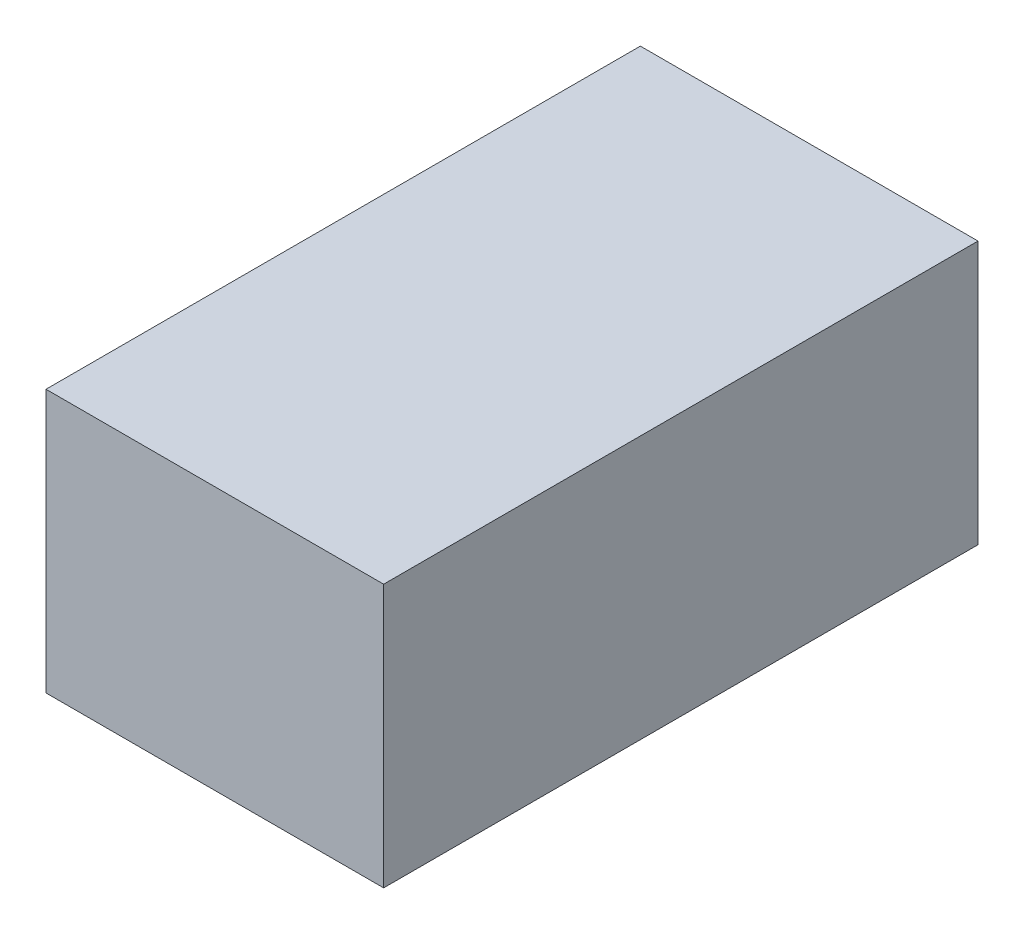
ISO-10303-21;
HEADER;
FILE_DESCRIPTION(('STEP AP214'),'2;1');
FILE_NAME('part.step','',(''),(''),'','','');
FILE_SCHEMA(('AUTOMOTIVE_DESIGN { 1 0 10303 214 1 1 1 1 }'));
ENDSEC;
DATA;
#1=APPLICATION_CONTEXT('core data for automotive mechanical design processes');
#2=APPLICATION_PROTOCOL_DEFINITION('international standard','automotive_design',2000,#1);
#3=PRODUCT_CONTEXT('',#1,'mechanical');
#4=PRODUCT('Part','Part','',(#3));
#5=PRODUCT_RELATED_PRODUCT_CATEGORY('part','',(#4));
#6=PRODUCT_DEFINITION_FORMATION('','',#4);
#7=PRODUCT_DEFINITION_CONTEXT('part definition',#1,'design');
#8=PRODUCT_DEFINITION('design','',#6,#7);
#9=PRODUCT_DEFINITION_SHAPE('','',#8);
#10=(LENGTH_UNIT() NAMED_UNIT(*) SI_UNIT(.MILLI.,.METRE.));
#11=(NAMED_UNIT(*) PLANE_ANGLE_UNIT() SI_UNIT($,.RADIAN.));
#12=(NAMED_UNIT(*) SI_UNIT($,.STERADIAN.) SOLID_ANGLE_UNIT());
#13=UNCERTAINTY_MEASURE_WITH_UNIT(LENGTH_MEASURE(1.E-05),#10,'distance_accuracy_value','');
#14=(GEOMETRIC_REPRESENTATION_CONTEXT(3) GLOBAL_UNCERTAINTY_ASSIGNED_CONTEXT((#13)) GLOBAL_UNIT_ASSIGNED_CONTEXT((#10,
#11,#12)) REPRESENTATION_CONTEXT('',''));
#15=CARTESIAN_POINT('',(0.,0.,0.));
#16=DIRECTION('',(0.,0.,1.));
#17=DIRECTION('',(1.,0.,0.));
#18=AXIS2_PLACEMENT_3D('',#15,#16,#17);
#19=CARTESIAN_POINT('',(13.35,-10.4,47.));
#20=DIRECTION('',(-1.,0.,0.));
#21=DIRECTION('',(0.,0.,1.));
#22=AXIS2_PLACEMENT_3D('',#19,#20,#21);
#23=PLANE('',#22);
#24=DIRECTION('',(0.,1.,0.));
#25=VECTOR('',#24,1.);
#26=CARTESIAN_POINT('',(13.35,-10.4,0.));
#27=LINE('',#26,#25);
#28=CARTESIAN_POINT('',(13.35,-10.4,0.));
#29=VERTEX_POINT('',#28);
#30=CARTESIAN_POINT('',(13.35,10.4,0.));
#31=VERTEX_POINT('',#30);
#32=EDGE_CURVE('E111',#29,#31,#27,.T.);
#33=ORIENTED_EDGE('',*,*,#32,.T.);
#34=DIRECTION('',(0.,0.,-1.));
#35=VECTOR('',#34,1.);
#36=CARTESIAN_POINT('',(13.35,10.4,47.));
#37=LINE('',#36,#35);
#38=CARTESIAN_POINT('',(13.35,10.4,47.));
#39=VERTEX_POINT('',#38);
#40=EDGE_CURVE('E11',#39,#31,#37,.T.);
#41=ORIENTED_EDGE('',*,*,#40,.F.);
#42=DIRECTION('',(0.,1.,0.));
#43=VECTOR('',#42,1.);
#44=CARTESIAN_POINT('',(13.35,-10.4,47.));
#45=LINE('',#44,#43);
#46=CARTESIAN_POINT('',(13.35,-10.4,47.));
#47=VERTEX_POINT('',#46);
#48=EDGE_CURVE('E100',#47,#39,#45,.T.);
#49=ORIENTED_EDGE('',*,*,#48,.F.);
#50=DIRECTION('',(0.,0.,-1.));
#51=VECTOR('',#50,1.);
#52=CARTESIAN_POINT('',(13.35,-10.4,47.));
#53=LINE('',#52,#51);
#54=EDGE_CURVE('E108',#47,#29,#53,.T.);
#55=ORIENTED_EDGE('',*,*,#54,.T.);
#56=EDGE_LOOP('',(#33,#41,#49,#55));
#57=FACE_BOUND('',#56,.T.);
#58=ADVANCED_FACE('F44',(#57),#23,.F.);
#59=CARTESIAN_POINT('',(-13.35,10.4,47.));
#60=DIRECTION('',(0.,-1.,0.));
#61=DIRECTION('',(0.,0.,-1.));
#62=AXIS2_PLACEMENT_3D('',#59,#60,#61);
#63=PLANE('',#62);
#64=DIRECTION('',(-1.,0.,0.));
#65=VECTOR('',#64,1.);
#66=CARTESIAN_POINT('',(-13.35,10.4,0.));
#67=LINE('',#66,#65);
#68=CARTESIAN_POINT('',(-13.35,10.4,0.));
#69=VERTEX_POINT('',#68);
#70=EDGE_CURVE('E105',#31,#69,#67,.T.);
#71=ORIENTED_EDGE('',*,*,#70,.T.);
#72=DIRECTION('',(0.,0.,-1.));
#73=VECTOR('',#72,1.);
#74=CARTESIAN_POINT('',(-13.35,10.4,47.));
#75=LINE('',#74,#73);
#76=CARTESIAN_POINT('',(-13.35,10.4,47.));
#77=VERTEX_POINT('',#76);
#78=EDGE_CURVE('E53',#77,#69,#75,.T.);
#79=ORIENTED_EDGE('',*,*,#78,.F.);
#80=DIRECTION('',(-1.,0.,0.));
#81=VECTOR('',#80,1.);
#82=CARTESIAN_POINT('',(-13.35,10.4,47.));
#83=LINE('',#82,#81);
#84=EDGE_CURVE('E95',#39,#77,#83,.T.);
#85=ORIENTED_EDGE('',*,*,#84,.F.);
#86=ORIENTED_EDGE('',*,*,#40,.T.);
#87=EDGE_LOOP('',(#71,#79,#85,#86));
#88=FACE_BOUND('',#87,.T.);
#89=ADVANCED_FACE('F102',(#88),#63,.F.);
#90=CARTESIAN_POINT('',(-13.35,-10.4,47.));
#91=DIRECTION('',(1.,0.,0.));
#92=DIRECTION('',(0.,0.,-1.));
#93=AXIS2_PLACEMENT_3D('',#90,#91,#92);
#94=PLANE('',#93);
#95=DIRECTION('',(0.,-1.,0.));
#96=VECTOR('',#95,1.);
#97=CARTESIAN_POINT('',(-13.35,-10.4,0.));
#98=LINE('',#97,#96);
#99=CARTESIAN_POINT('',(-13.35,-10.4,0.));
#100=VERTEX_POINT('',#99);
#101=EDGE_CURVE('E80',#69,#100,#98,.T.);
#102=ORIENTED_EDGE('',*,*,#101,.T.);
#103=DIRECTION('',(0.,0.,-1.));
#104=VECTOR('',#103,1.);
#105=CARTESIAN_POINT('',(-13.35,-10.4,47.));
#106=LINE('',#105,#104);
#107=CARTESIAN_POINT('',(-13.35,-10.4,47.));
#108=VERTEX_POINT('',#107);
#109=EDGE_CURVE('E101',#108,#100,#106,.T.);
#110=ORIENTED_EDGE('',*,*,#109,.F.);
#111=DIRECTION('',(0.,-1.,0.));
#112=VECTOR('',#111,1.);
#113=CARTESIAN_POINT('',(-13.35,-10.4,47.));
#114=LINE('',#113,#112);
#115=EDGE_CURVE('E94',#77,#108,#114,.T.);
#116=ORIENTED_EDGE('',*,*,#115,.F.);
#117=ORIENTED_EDGE('',*,*,#78,.T.);
#118=EDGE_LOOP('',(#102,#110,#116,#117));
#119=FACE_BOUND('',#118,.T.);
#120=ADVANCED_FACE('F103',(#119),#94,.F.);
#121=CARTESIAN_POINT('',(-13.35,-10.4,47.));
#122=DIRECTION('',(0.,1.,0.));
#123=DIRECTION('',(0.,0.,1.));
#124=AXIS2_PLACEMENT_3D('',#121,#122,#123);
#125=PLANE('',#124);
#126=DIRECTION('',(1.,0.,0.));
#127=VECTOR('',#126,1.);
#128=CARTESIAN_POINT('',(-13.35,-10.4,0.));
#129=LINE('',#128,#127);
#130=EDGE_CURVE('E82',#100,#29,#129,.T.);
#131=ORIENTED_EDGE('',*,*,#130,.T.);
#132=ORIENTED_EDGE('',*,*,#54,.F.);
#133=DIRECTION('',(1.,0.,0.));
#134=VECTOR('',#133,1.);
#135=CARTESIAN_POINT('',(-13.35,-10.4,47.));
#136=LINE('',#135,#134);
#137=EDGE_CURVE('E62',#108,#47,#136,.T.);
#138=ORIENTED_EDGE('',*,*,#137,.F.);
#139=ORIENTED_EDGE('',*,*,#109,.T.);
#140=EDGE_LOOP('',(#131,#132,#138,#139));
#141=FACE_BOUND('',#140,.T.);
#142=ADVANCED_FACE('F128',(#141),#125,.F.);
#143=CARTESIAN_POINT('',(0.,0.,47.));
#144=DIRECTION('',(0.,0.,-1.));
#145=DIRECTION('',(-1.,0.,0.));
#146=AXIS2_PLACEMENT_3D('',#143,#144,#145);
#147=PLANE('',#146);
#148=ORIENTED_EDGE('',*,*,#48,.T.);
#149=ORIENTED_EDGE('',*,*,#84,.T.);
#150=ORIENTED_EDGE('',*,*,#115,.T.);
#151=ORIENTED_EDGE('',*,*,#137,.T.);
#152=EDGE_LOOP('',(#148,#149,#150,#151));
#153=FACE_BOUND('',#152,.T.);
#154=ADVANCED_FACE('F93',(#153),#147,.F.);
#155=CARTESIAN_POINT('',(0.,0.,0.));
#156=DIRECTION('',(0.,0.,-1.));
#157=DIRECTION('',(-1.,0.,0.));
#158=AXIS2_PLACEMENT_3D('',#155,#156,#157);
#159=PLANE('',#158);
#160=ORIENTED_EDGE('',*,*,#32,.F.);
#161=ORIENTED_EDGE('',*,*,#130,.F.);
#162=ORIENTED_EDGE('',*,*,#101,.F.);
#163=ORIENTED_EDGE('',*,*,#70,.F.);
#164=EDGE_LOOP('',(#160,#161,#162,#163));
#165=FACE_BOUND('',#164,.T.);
#166=ADVANCED_FACE('F129',(#165),#159,.T.);
#167=CLOSED_SHELL('',(#58,#89,#120,#142,#154,#166));
#168=MANIFOLD_SOLID_BREP('B2',#167);
#169=ADVANCED_BREP_SHAPE_REPRESENTATION('',(#18,#168),#14);
#170=SHAPE_DEFINITION_REPRESENTATION(#9,#169);
ENDSEC;
END-ISO-10303-21;
